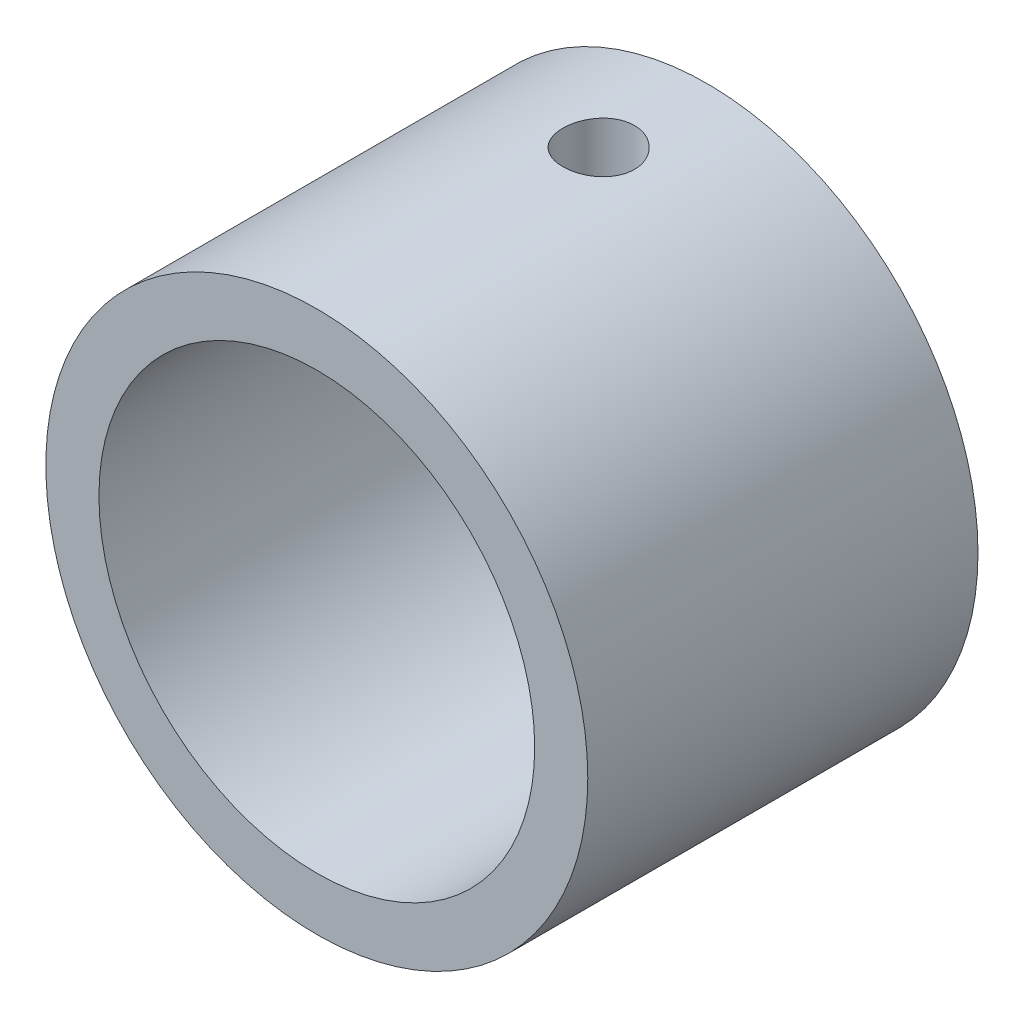
ISO-10303-21;
HEADER;
FILE_DESCRIPTION(('STEP AP214'),'2;1');
FILE_NAME('part.step','',(''),(''),'','','');
FILE_SCHEMA(('AUTOMOTIVE_DESIGN { 1 0 10303 214 1 1 1 1 }'));
ENDSEC;
DATA;
#1=APPLICATION_CONTEXT('core data for automotive mechanical design processes');
#2=APPLICATION_PROTOCOL_DEFINITION('international standard','automotive_design',2000,#1);
#3=PRODUCT_CONTEXT('',#1,'mechanical');
#4=PRODUCT('Part','Part','',(#3));
#5=PRODUCT_RELATED_PRODUCT_CATEGORY('part','',(#4));
#6=PRODUCT_DEFINITION_FORMATION('','',#4);
#7=PRODUCT_DEFINITION_CONTEXT('part definition',#1,'design');
#8=PRODUCT_DEFINITION('design','',#6,#7);
#9=PRODUCT_DEFINITION_SHAPE('','',#8);
#10=(LENGTH_UNIT() NAMED_UNIT(*) SI_UNIT(.MILLI.,.METRE.));
#11=(NAMED_UNIT(*) PLANE_ANGLE_UNIT() SI_UNIT($,.RADIAN.));
#12=(NAMED_UNIT(*) SI_UNIT($,.STERADIAN.) SOLID_ANGLE_UNIT());
#13=UNCERTAINTY_MEASURE_WITH_UNIT(LENGTH_MEASURE(1.E-05),#10,'distance_accuracy_value','');
#14=(GEOMETRIC_REPRESENTATION_CONTEXT(3) GLOBAL_UNCERTAINTY_ASSIGNED_CONTEXT((#13)) GLOBAL_UNIT_ASSIGNED_CONTEXT((#10,
#11,#12)) REPRESENTATION_CONTEXT('',''));
#15=CARTESIAN_POINT('',(0.,0.,0.));
#16=DIRECTION('',(0.,0.,1.));
#17=DIRECTION('',(1.,0.,0.));
#18=AXIS2_PLACEMENT_3D('',#15,#16,#17);
#19=CARTESIAN_POINT('',(0.,0.,18.));
#20=DIRECTION('',(0.,0.,-1.));
#21=DIRECTION('',(-1.,0.,0.));
#22=AXIS2_PLACEMENT_3D('',#19,#20,#21);
#23=CYLINDRICAL_SURFACE('',#22,12.5);
#24=CARTESIAN_POINT('',(0.,12.5,3.35));
#25=CARTESIAN_POINT('',(0.0922509659142324,12.4999986553884,3.35000389150703));
#26=CARTESIAN_POINT('',(0.184558502715377,12.498968007311,3.35776267709436));
#27=CARTESIAN_POINT('',(0.366601950920958,12.4949556982822,3.38858980345606));
#28=CARTESIAN_POINT('',(0.4563351259759,12.4919720361882,3.41167384749907));
#29=CARTESIAN_POINT('',(0.630568283941343,12.4843896079466,3.47245693419571));
#30=CARTESIAN_POINT('',(0.71507185631948,12.4797919643879,3.51014582048222));
#31=CARTESIAN_POINT('',(0.876539590939074,12.4694920533569,3.59904581496625));
#32=CARTESIAN_POINT('',(0.953504978702877,12.4637899658902,3.65025472012364));
#33=CARTESIAN_POINT('',(1.09819718658205,12.4518781663594,3.7650753837501));
#34=CARTESIAN_POINT('',(1.1658712816474,12.4456658531834,3.82875332108865));
#35=CARTESIAN_POINT('',(1.28960557413889,12.4334545778039,3.9665622546111));
#36=CARTESIAN_POINT('',(1.34566516063208,12.4274556268374,4.04069380031909));
#37=CARTESIAN_POINT('',(1.44477796066646,12.4163248280925,4.19765149365061));
#38=CARTESIAN_POINT('',(1.48778133107337,12.4111963353939,4.28050937377425));
#39=CARTESIAN_POINT('',(1.55924262980494,12.4024218004722,4.45235015180618));
#40=CARTESIAN_POINT('',(1.58770117215908,12.3987756956693,4.54133279096954));
#41=CARTESIAN_POINT('',(1.62910377910463,12.3934038347284,4.72234784890981));
#42=CARTESIAN_POINT('',(1.64213723047393,12.3916670186782,4.81435948871567));
#43=CARTESIAN_POINT('',(1.6525963615546,12.3902766213381,4.99927914827236));
#44=CARTESIAN_POINT('',(1.65002273886784,12.3906229469364,5.09218712777345));
#45=CARTESIAN_POINT('',(1.6294140660036,12.3933495814873,5.27563699086018));
#46=CARTESIAN_POINT('',(1.61147776254764,12.395716899785,5.36619018822611));
#47=CARTESIAN_POINT('',(1.56080707632498,12.4021985149079,5.54299015751685));
#48=CARTESIAN_POINT('',(1.52807236230629,12.4063128508388,5.6292368329952));
#49=CARTESIAN_POINT('',(1.44862884068035,12.4158395520745,5.79528063970321));
#50=CARTESIAN_POINT('',(1.40187740731702,12.4212558666767,5.87505714083283));
#51=CARTESIAN_POINT('',(1.29575800474392,12.4327732471151,6.02566987367712));
#52=CARTESIAN_POINT('',(1.23638939245273,12.4388743478466,6.09650564940105));
#53=CARTESIAN_POINT('',(1.10617499798151,12.4511315214541,6.22779910123927));
#54=CARTESIAN_POINT('',(1.03524415653744,12.4572876551224,6.288172443475));
#55=CARTESIAN_POINT('',(0.884210857811213,12.4689172796715,6.3961696449878));
#56=CARTESIAN_POINT('',(0.804108375018418,12.4743907686536,6.44379346880128));
#57=CARTESIAN_POINT('',(0.636938460986385,12.484042355461,6.5249409446003));
#58=CARTESIAN_POINT('',(0.549868279152675,12.4882199385046,6.55845899513268));
#59=CARTESIAN_POINT('',(0.371267976474138,12.4948044580827,6.61037485956513));
#60=CARTESIAN_POINT('',(0.279738088894881,12.4972114871206,6.6287734633927));
#61=CARTESIAN_POINT('',(0.0955454110605672,12.4999716099048,6.64981811969115));
#62=CARTESIAN_POINT('',(0.00289610511857279,12.5003398427993,6.65258028450897));
#63=CARTESIAN_POINT('',(-0.181544148381852,12.4990218465851,6.64258054262136));
#64=CARTESIAN_POINT('',(-0.273335116324652,12.4973356663916,6.62981900553124));
#65=CARTESIAN_POINT('',(-0.453108088985705,12.4921077115532,6.5892306026245));
#66=CARTESIAN_POINT('',(-0.54110288153432,12.4885727966281,6.56145941737239));
#67=CARTESIAN_POINT('',(-0.711186579168435,12.4800429260914,6.49169814598314));
#68=CARTESIAN_POINT('',(-0.793275262802482,12.4750479157687,6.44970752702029));
#69=CARTESIAN_POINT('',(-0.949733027407939,12.4641165128389,6.35242066007777));
#70=CARTESIAN_POINT('',(-1.02405527014396,12.4581748993319,6.29704968324978));
#71=CARTESIAN_POINT('',(-1.16239311646149,12.4460304374708,6.17467915559439));
#72=CARTESIAN_POINT('',(-1.22640826160188,12.4398275775125,6.10767908780128));
#73=CARTESIAN_POINT('',(-1.34272949930146,12.427812668937,5.96343933060332));
#74=CARTESIAN_POINT('',(-1.39495839046207,12.422003362126,5.88613712057612));
#75=CARTESIAN_POINT('',(-1.48569034045958,12.4114793355964,5.72378924080387));
#76=CARTESIAN_POINT('',(-1.52419370073337,12.40676459184,5.63874374116663));
#77=CARTESIAN_POINT('',(-1.58625802021031,12.3989825257156,5.46356754240219));
#78=CARTESIAN_POINT('',(-1.60986174308102,12.395910492496,5.37345221257723));
#79=CARTESIAN_POINT('',(-1.64159408961649,12.3917484325846,5.19049367855156));
#80=CARTESIAN_POINT('',(-1.64972352322195,12.390658302158,5.09765061738152));
#81=CARTESIAN_POINT('',(-1.65026050729394,12.3905867313463,4.91264048140781));
#82=CARTESIAN_POINT('',(-1.6427893634322,12.3915890208826,4.82047374161902));
#83=CARTESIAN_POINT('',(-1.61259495475241,12.3955542787341,4.63871858376871));
#84=CARTESIAN_POINT('',(-1.58987169439037,12.3985172464765,4.54913016495395));
#85=CARTESIAN_POINT('',(-1.52985734760344,12.4060648042427,4.37509536720208));
#86=CARTESIAN_POINT('',(-1.49257280459361,12.4106486657967,4.2906466982857));
#87=CARTESIAN_POINT('',(-1.40450618423476,12.4209226365687,4.12918453461483));
#88=CARTESIAN_POINT('',(-1.35372386121888,12.4266127659209,4.05217117522175));
#89=CARTESIAN_POINT('',(-1.23965546715595,12.4385110765891,3.90714655415514));
#90=CARTESIAN_POINT('',(-1.17627910409951,12.4447228000133,3.8392065959392));
#91=CARTESIAN_POINT('',(-1.03901112502639,12.4569335544568,3.71488064994685));
#92=CARTESIAN_POINT('',(-0.965117043774381,12.4629325351987,3.65849737850979));
#93=CARTESIAN_POINT('',(-0.808549280168614,12.4740702486112,3.55867888501618));
#94=CARTESIAN_POINT('',(-0.725839748433107,12.4792052313115,3.51529949779812));
#95=CARTESIAN_POINT('',(-0.554286102127641,12.4879988146703,3.44310916931126));
#96=CARTESIAN_POINT('',(-0.465448689177245,12.4916589991428,3.41428259103999));
#97=CARTESIAN_POINT('',(-0.313472456145789,12.4962204250721,3.37882265613531));
#98=CARTESIAN_POINT('',(-0.251287086879961,12.4976307637456,3.36802994756124));
#99=CARTESIAN_POINT('',(-0.126076615825899,12.4995210067266,3.3536173203671));
#100=CARTESIAN_POINT('',(-0.0630515212430907,12.5000009190127,3.3499973402399));
#101=CARTESIAN_POINT('',(0.,12.5,3.35));
#102=B_SPLINE_CURVE_WITH_KNOTS('',3,(#24,#25,#26,#27,#28,#29,#30,#31,#32,#33,#34,#35,#36,#37,
#38,#39,#40,#41,#42,#43,#44,#45,#46,#47,#48,#49,#50,#51,#52,#53,#54,#55,#56,#57,#58,#59,#60,#61,
#62,#63,#64,#65,#66,#67,#68,#69,#70,#71,#72,#73,#74,#75,#76,#77,#78,#79,#80,#81,#82,#83,#84,#85,
#86,#87,#88,#89,#90,#91,#92,#93,#94,#95,#96,#97,#98,#99,#100,#101),.UNSPECIFIED.,.T.,.F.,(4,2,2,
2,2,2,2,2,2,2,2,2,2,2,2,2,2,2,2,2,2,2,2,2,2,2,2,2,2,2,2,2,2,2,2,2,2,2,4),(0.,0.27652256759341,
0.553328916636196,0.829943115961213,1.106512269752,1.38459116209452,1.66268467791007,
1.94182686179847,2.22095726035026,2.49846208170459,2.77595449929574,3.05167655007196,
3.32740477299745,3.60398015842833,3.88056964393413,4.159294237539,4.43801960642627,
4.71685555395558,4.99567693255305,5.27242510869489,5.5491666956633,5.82488864439133,
6.10062092602062,6.37793027840446,6.65525196160273,6.93434056471004,7.21342303816142,
7.49170082672567,7.76996404953484,8.04607163604137,8.3221791418815,8.59816271557356,
8.87415131265901,9.15219502941573,9.43030402415318,9.70959057439001,9.98857638890452,
10.1775751477029,10.3665722858035),.UNSPECIFIED.);
#103=CARTESIAN_POINT('',(0.,12.5,3.35));
#104=VERTEX_POINT('',#103);
#105=EDGE_CURVE('E76',#104,#104,#102,.T.);
#106=ORIENTED_EDGE('',*,*,#105,.T.);
#107=EDGE_LOOP('',(#106));
#108=FACE_BOUND('',#107,.T.);
#109=CARTESIAN_POINT('',(0.,-12.5,3.35));
#110=CARTESIAN_POINT('',(-0.0922509659142324,-12.4999986553884,3.35000389150703));
#111=CARTESIAN_POINT('',(-0.184558502715377,-12.498968007311,3.35776267709436));
#112=CARTESIAN_POINT('',(-0.366601950920958,-12.4949556982822,3.38858980345606));
#113=CARTESIAN_POINT('',(-0.4563351259759,-12.4919720361882,3.41167384749907));
#114=CARTESIAN_POINT('',(-0.630568283941343,-12.4843896079466,3.47245693419571));
#115=CARTESIAN_POINT('',(-0.71507185631948,-12.4797919643879,3.51014582048222));
#116=CARTESIAN_POINT('',(-0.876539590939074,-12.4694920533569,3.59904581496625));
#117=CARTESIAN_POINT('',(-0.953504978702877,-12.4637899658902,3.65025472012364));
#118=CARTESIAN_POINT('',(-1.09819718658205,-12.4518781663594,3.7650753837501));
#119=CARTESIAN_POINT('',(-1.1658712816474,-12.4456658531834,3.82875332108865));
#120=CARTESIAN_POINT('',(-1.28960557413889,-12.4334545778039,3.9665622546111));
#121=CARTESIAN_POINT('',(-1.34566516063208,-12.4274556268374,4.04069380031909));
#122=CARTESIAN_POINT('',(-1.44477796066646,-12.4163248280925,4.19765149365061));
#123=CARTESIAN_POINT('',(-1.48778133107337,-12.4111963353939,4.28050937377425));
#124=CARTESIAN_POINT('',(-1.55924262980494,-12.4024218004722,4.45235015180618));
#125=CARTESIAN_POINT('',(-1.58770117215908,-12.3987756956693,4.54133279096954));
#126=CARTESIAN_POINT('',(-1.62910377910463,-12.3934038347284,4.72234784890981));
#127=CARTESIAN_POINT('',(-1.64213723047393,-12.3916670186782,4.81435948871567));
#128=CARTESIAN_POINT('',(-1.6525963615546,-12.3902766213381,4.99927914827236));
#129=CARTESIAN_POINT('',(-1.65002273886784,-12.3906229469364,5.09218712777345));
#130=CARTESIAN_POINT('',(-1.6294140660036,-12.3933495814873,5.27563699086018));
#131=CARTESIAN_POINT('',(-1.61147776254764,-12.395716899785,5.36619018822611));
#132=CARTESIAN_POINT('',(-1.56080707632498,-12.4021985149079,5.54299015751685));
#133=CARTESIAN_POINT('',(-1.52807236230629,-12.4063128508388,5.6292368329952));
#134=CARTESIAN_POINT('',(-1.44862884068035,-12.4158395520745,5.79528063970321));
#135=CARTESIAN_POINT('',(-1.40187740731702,-12.4212558666767,5.87505714083283));
#136=CARTESIAN_POINT('',(-1.29575800474392,-12.4327732471151,6.02566987367712));
#137=CARTESIAN_POINT('',(-1.23638939245273,-12.4388743478466,6.09650564940105));
#138=CARTESIAN_POINT('',(-1.10617499798151,-12.4511315214541,6.22779910123927));
#139=CARTESIAN_POINT('',(-1.03524415653744,-12.4572876551224,6.288172443475));
#140=CARTESIAN_POINT('',(-0.884210857811213,-12.4689172796715,6.3961696449878));
#141=CARTESIAN_POINT('',(-0.804108375018418,-12.4743907686536,6.44379346880128));
#142=CARTESIAN_POINT('',(-0.636938460986385,-12.484042355461,6.5249409446003));
#143=CARTESIAN_POINT('',(-0.549868279152675,-12.4882199385046,6.55845899513268));
#144=CARTESIAN_POINT('',(-0.371267976474138,-12.4948044580827,6.61037485956513));
#145=CARTESIAN_POINT('',(-0.279738088894881,-12.4972114871206,6.6287734633927));
#146=CARTESIAN_POINT('',(-0.0955454110605672,-12.4999716099048,6.64981811969115));
#147=CARTESIAN_POINT('',(-0.00289610511857279,-12.5003398427993,6.65258028450897));
#148=CARTESIAN_POINT('',(0.181544148381852,-12.4990218465851,6.64258054262136));
#149=CARTESIAN_POINT('',(0.273335116324652,-12.4973356663916,6.62981900553124));
#150=CARTESIAN_POINT('',(0.453108088985705,-12.4921077115532,6.5892306026245));
#151=CARTESIAN_POINT('',(0.54110288153432,-12.4885727966281,6.56145941737239));
#152=CARTESIAN_POINT('',(0.711186579168435,-12.4800429260914,6.49169814598314));
#153=CARTESIAN_POINT('',(0.793275262802482,-12.4750479157687,6.44970752702029));
#154=CARTESIAN_POINT('',(0.949733027407939,-12.4641165128389,6.35242066007777));
#155=CARTESIAN_POINT('',(1.02405527014396,-12.4581748993319,6.29704968324978));
#156=CARTESIAN_POINT('',(1.16239311646149,-12.4460304374708,6.17467915559439));
#157=CARTESIAN_POINT('',(1.22640826160188,-12.4398275775125,6.10767908780128));
#158=CARTESIAN_POINT('',(1.34272949930146,-12.427812668937,5.96343933060332));
#159=CARTESIAN_POINT('',(1.39495839046207,-12.422003362126,5.88613712057612));
#160=CARTESIAN_POINT('',(1.48569034045958,-12.4114793355964,5.72378924080387));
#161=CARTESIAN_POINT('',(1.52419370073337,-12.40676459184,5.63874374116663));
#162=CARTESIAN_POINT('',(1.58625802021031,-12.3989825257156,5.46356754240219));
#163=CARTESIAN_POINT('',(1.60986174308102,-12.395910492496,5.37345221257723));
#164=CARTESIAN_POINT('',(1.64159408961649,-12.3917484325846,5.19049367855156));
#165=CARTESIAN_POINT('',(1.64972352322195,-12.390658302158,5.09765061738152));
#166=CARTESIAN_POINT('',(1.65026050729394,-12.3905867313463,4.91264048140781));
#167=CARTESIAN_POINT('',(1.6427893634322,-12.3915890208826,4.82047374161902));
#168=CARTESIAN_POINT('',(1.61259495475241,-12.3955542787341,4.63871858376871));
#169=CARTESIAN_POINT('',(1.58987169439037,-12.3985172464765,4.54913016495395));
#170=CARTESIAN_POINT('',(1.52985734760344,-12.4060648042427,4.37509536720208));
#171=CARTESIAN_POINT('',(1.49257280459361,-12.4106486657967,4.2906466982857));
#172=CARTESIAN_POINT('',(1.40450618423476,-12.4209226365687,4.12918453461483));
#173=CARTESIAN_POINT('',(1.35372386121888,-12.4266127659209,4.05217117522175));
#174=CARTESIAN_POINT('',(1.23965546715595,-12.4385110765891,3.90714655415514));
#175=CARTESIAN_POINT('',(1.17627910409951,-12.4447228000133,3.8392065959392));
#176=CARTESIAN_POINT('',(1.03901112502639,-12.4569335544568,3.71488064994685));
#177=CARTESIAN_POINT('',(0.965117043774381,-12.4629325351987,3.65849737850979));
#178=CARTESIAN_POINT('',(0.808549280168614,-12.4740702486112,3.55867888501618));
#179=CARTESIAN_POINT('',(0.725839748433107,-12.4792052313115,3.51529949779812));
#180=CARTESIAN_POINT('',(0.554286102127641,-12.4879988146703,3.44310916931126));
#181=CARTESIAN_POINT('',(0.465448689177245,-12.4916589991428,3.41428259103999));
#182=CARTESIAN_POINT('',(0.313472456145789,-12.4962204250721,3.37882265613531));
#183=CARTESIAN_POINT('',(0.251287086879961,-12.4976307637456,3.36802994756124));
#184=CARTESIAN_POINT('',(0.126076615825899,-12.4995210067266,3.3536173203671));
#185=CARTESIAN_POINT('',(0.0630515212430907,-12.5000009190127,3.3499973402399));
#186=CARTESIAN_POINT('',(0.,-12.5,3.35));
#187=B_SPLINE_CURVE_WITH_KNOTS('',3,(#109,#110,#111,#112,#113,#114,#115,#116,#117,#118,#119,
#120,#121,#122,#123,#124,#125,#126,#127,#128,#129,#130,#131,#132,#133,#134,#135,#136,#137,#138,
#139,#140,#141,#142,#143,#144,#145,#146,#147,#148,#149,#150,#151,#152,#153,#154,#155,#156,#157,
#158,#159,#160,#161,#162,#163,#164,#165,#166,#167,#168,#169,#170,#171,#172,#173,#174,#175,#176,
#177,#178,#179,#180,#181,#182,#183,#184,#185,#186),.UNSPECIFIED.,.T.,.F.,(4,2,2,2,2,2,2,2,2,2,2,
2,2,2,2,2,2,2,2,2,2,2,2,2,2,2,2,2,2,2,2,2,2,2,2,2,2,2,4),(0.,0.27652256759341,0.553328916636196,
0.829943115961213,1.106512269752,1.38459116209452,1.66268467791007,1.94182686179847,
2.22095726035026,2.49846208170459,2.77595449929574,3.05167655007196,3.32740477299745,
3.60398015842833,3.88056964393413,4.159294237539,4.43801960642627,4.71685555395558,
4.99567693255305,5.27242510869489,5.5491666956633,5.82488864439133,6.10062092602062,
6.37793027840446,6.65525196160273,6.93434056471004,7.21342303816142,7.49170082672567,
7.76996404953484,8.04607163604137,8.3221791418815,8.59816271557356,8.87415131265901,
9.15219502941573,9.43030402415318,9.70959057439001,9.98857638890452,10.1775751477029,
10.3665722858035),.UNSPECIFIED.);
#188=CARTESIAN_POINT('',(0.,-12.5,3.35));
#189=VERTEX_POINT('',#188);
#190=EDGE_CURVE('E71',#189,#189,#187,.T.);
#191=ORIENTED_EDGE('',*,*,#190,.T.);
#192=EDGE_LOOP('',(#191));
#193=FACE_BOUND('',#192,.T.);
#194=CARTESIAN_POINT('',(0.,0.,18.));
#195=DIRECTION('',(0.,0.,1.));
#196=DIRECTION('',(1.,0.,0.));
#197=AXIS2_PLACEMENT_3D('',#194,#195,#196);
#198=CIRCLE('',#197,12.5);
#199=CARTESIAN_POINT('',(12.5,0.,18.));
#200=VERTEX_POINT('',#199);
#201=EDGE_CURVE('E10',#200,#200,#198,.T.);
#202=ORIENTED_EDGE('',*,*,#201,.F.);
#203=EDGE_LOOP('',(#202));
#204=FACE_BOUND('',#203,.T.);
#205=CARTESIAN_POINT('',(0.,0.,0.));
#206=DIRECTION('',(0.,0.,1.));
#207=DIRECTION('',(1.,0.,0.));
#208=AXIS2_PLACEMENT_3D('',#205,#206,#207);
#209=CIRCLE('',#208,12.5);
#210=CARTESIAN_POINT('',(12.5,0.,0.));
#211=VERTEX_POINT('',#210);
#212=EDGE_CURVE('E44',#211,#211,#209,.T.);
#213=ORIENTED_EDGE('',*,*,#212,.T.);
#214=EDGE_LOOP('',(#213));
#215=FACE_BOUND('',#214,.T.);
#216=ADVANCED_FACE('F31',(#108,#193,#204,#215),#23,.T.);
#217=CARTESIAN_POINT('',(0.,0.,18.));
#218=DIRECTION('',(0.,0.,1.));
#219=DIRECTION('',(1.,0.,0.));
#220=AXIS2_PLACEMENT_3D('',#217,#218,#219);
#221=PLANE('',#220);
#222=CARTESIAN_POINT('',(0.,0.,18.));
#223=DIRECTION('',(0.,0.,1.));
#224=DIRECTION('',(1.,0.,0.));
#225=AXIS2_PLACEMENT_3D('',#222,#223,#224);
#226=CIRCLE('',#225,10.05);
#227=CARTESIAN_POINT('',(10.05,0.,18.));
#228=VERTEX_POINT('',#227);
#229=EDGE_CURVE('E49',#228,#228,#226,.T.);
#230=ORIENTED_EDGE('',*,*,#229,.F.);
#231=EDGE_LOOP('',(#230));
#232=FACE_BOUND('',#231,.T.);
#233=ORIENTED_EDGE('',*,*,#201,.T.);
#234=EDGE_LOOP('',(#233));
#235=FACE_BOUND('',#234,.T.);
#236=ADVANCED_FACE('F90',(#232,#235),#221,.T.);
#237=CARTESIAN_POINT('',(0.,0.,0.));
#238=DIRECTION('',(0.,0.,1.));
#239=DIRECTION('',(1.,0.,0.));
#240=AXIS2_PLACEMENT_3D('',#237,#238,#239);
#241=PLANE('',#240);
#242=CARTESIAN_POINT('',(0.,0.,0.));
#243=DIRECTION('',(0.,0.,1.));
#244=DIRECTION('',(1.,0.,0.));
#245=AXIS2_PLACEMENT_3D('',#242,#243,#244);
#246=CIRCLE('',#245,10.05);
#247=CARTESIAN_POINT('',(10.05,0.,0.));
#248=VERTEX_POINT('',#247);
#249=EDGE_CURVE('E81',#248,#248,#246,.T.);
#250=ORIENTED_EDGE('',*,*,#249,.T.);
#251=EDGE_LOOP('',(#250));
#252=FACE_BOUND('',#251,.T.);
#253=ORIENTED_EDGE('',*,*,#212,.F.);
#254=EDGE_LOOP('',(#253));
#255=FACE_BOUND('',#254,.T.);
#256=ADVANCED_FACE('F92',(#252,#255),#241,.F.);
#257=CARTESIAN_POINT('',(0.,0.,0.));
#258=DIRECTION('',(0.,0.,1.));
#259=DIRECTION('',(1.,0.,0.));
#260=AXIS2_PLACEMENT_3D('',#257,#258,#259);
#261=CYLINDRICAL_SURFACE('',#260,10.05);
#262=CARTESIAN_POINT('',(0.,10.05,3.35));
#263=CARTESIAN_POINT('',(-0.0920180329327724,10.0499984370443,3.35000370692742));
#264=CARTESIAN_POINT('',(-0.184086780494825,10.0487230447276,3.35772356253367));
#265=CARTESIAN_POINT('',(-0.365643401070694,10.043758055606,3.3883869572058));
#266=CARTESIAN_POINT('',(-0.455128798557863,10.0400662184774,3.41134462376199));
#267=CARTESIAN_POINT('',(-0.628865582833329,10.0306825513681,3.47177292893355));
#268=CARTESIAN_POINT('',(-0.713121136953697,10.0249923384807,3.50923183559006));
#269=CARTESIAN_POINT('',(-0.874140021172378,10.0122380593047,3.597568894481));
#270=CARTESIAN_POINT('',(-0.950904235109421,10.0051741553811,3.64844546105259));
#271=CARTESIAN_POINT('',(-1.09548549310904,9.99038259054436,3.76267647057008));
#272=CARTESIAN_POINT('',(-1.16322285823918,9.98264990017795,3.82613112195422));
#273=CARTESIAN_POINT('',(-1.28713945807741,9.96743091485469,3.96350137039993));
#274=CARTESIAN_POINT('',(-1.34331797358523,9.95994463525404,4.03741761790716));
#275=CARTESIAN_POINT('',(-1.44284008040123,9.94601737362578,4.19415834085049));
#276=CARTESIAN_POINT('',(-1.48610514301644,9.93958289060425,4.27703330569017));
#277=CARTESIAN_POINT('',(-1.55807008090098,9.92855736502088,4.44899761843703));
#278=CARTESIAN_POINT('',(-1.58677091013214,9.92396620172512,4.53808655889197));
#279=CARTESIAN_POINT('',(-1.62854217790329,9.91719711345879,4.71910630428544));
#280=CARTESIAN_POINT('',(-1.64175000182619,9.91499798978263,4.81100459920139));
#281=CARTESIAN_POINT('',(-1.65258624588289,9.91319781090221,4.99573731639622));
#282=CARTESIAN_POINT('',(-1.65021573599762,9.91359657726467,5.08857167394535));
#283=CARTESIAN_POINT('',(-1.63007456453797,9.91692776354158,5.27156215550139));
#284=CARTESIAN_POINT('',(-1.61245802990308,9.9198348254104,5.36173577246638));
#285=CARTESIAN_POINT('',(-1.5625666612546,9.92781536861481,5.53782979523721));
#286=CARTESIAN_POINT('',(-1.53029133811106,9.93288892224089,5.62375005901237));
#287=CARTESIAN_POINT('',(-1.4518416805706,9.94465827599469,5.78936099332723));
#288=CARTESIAN_POINT('',(-1.40560314536227,9.9513615409385,5.86902069974417));
#289=CARTESIAN_POINT('',(-1.30058520962102,9.96562981296695,6.01950904256078));
#290=CARTESIAN_POINT('',(-1.24180482624939,9.97319488756541,6.09033698617203));
#291=CARTESIAN_POINT('',(-1.11253101844653,9.98844590415614,6.22204358941843));
#292=CARTESIAN_POINT('',(-1.04190531219169,9.9961322060661,6.28279244386867));
#293=CARTESIAN_POINT('',(-0.891393586399611,10.0106755195969,6.3915963402664));
#294=CARTESIAN_POINT('',(-0.811507510433438,10.0175325261638,6.43965130485664));
#295=CARTESIAN_POINT('',(-0.644622153004777,10.0296539695544,6.52171432728708));
#296=CARTESIAN_POINT('',(-0.557617245689085,10.034917131052,6.55571114431169));
#297=CARTESIAN_POINT('',(-0.37902696025481,10.043247566799,6.60857355080302));
#298=CARTESIAN_POINT('',(-0.28744195446806,10.0463150192357,6.62744036812168));
#299=CARTESIAN_POINT('',(-0.103410268552478,10.0498845138255,6.64933177207762));
#300=CARTESIAN_POINT('',(-0.010985330485597,10.0504154170395,6.65253459486102));
#301=CARTESIAN_POINT('',(0.173080735114018,10.0489309673542,6.64348195240312));
#302=CARTESIAN_POINT('',(0.264721891753469,10.0469157094267,6.63122706373508));
#303=CARTESIAN_POINT('',(0.444070159748101,10.0405832398353,6.59175511202367));
#304=CARTESIAN_POINT('',(0.531797163208801,10.0362795750517,6.56462607168771));
#305=CARTESIAN_POINT('',(0.701457781611595,10.0258509758994,6.49626958828008));
#306=CARTESIAN_POINT('',(0.783391078972734,10.0197259417883,6.45504137308651));
#307=CARTESIAN_POINT('',(0.939914183530767,10.0062626620491,6.35924709668296));
#308=CARTESIAN_POINT('',(1.01443481237377,9.99891444029673,6.30456943038438));
#309=CARTESIAN_POINT('',(1.1533063276579,9.98385059246088,6.1835821626607));
#310=CARTESIAN_POINT('',(1.21765649802128,9.97613494055729,6.11727174289406));
#311=CARTESIAN_POINT('',(1.33501923010389,9.96111279236415,5.97410279586138));
#312=CARTESIAN_POINT('',(1.38791151159428,9.95381118014088,5.89714507603676));
#313=CARTESIAN_POINT('',(1.48001763416633,9.94053430854275,5.7353323097033));
#314=CARTESIAN_POINT('',(1.51923189941182,9.93455900804024,5.65047750819129));
#315=CARTESIAN_POINT('',(1.58268792942257,9.92464775693468,5.47561907962732));
#316=CARTESIAN_POINT('',(1.60699009562649,9.92070358981418,5.38563785892158));
#317=CARTESIAN_POINT('',(1.64012250401262,9.91528037333729,5.20280055377115));
#318=CARTESIAN_POINT('',(1.64895404762513,9.91380111662654,5.10994471181616));
#319=CARTESIAN_POINT('',(1.6508590472903,9.91348396139325,4.92519472572506));
#320=CARTESIAN_POINT('',(1.64412179582373,9.9146143336567,4.83330253284866));
#321=CARTESIAN_POINT('',(1.61548919275561,9.91931962358776,4.65197792882349));
#322=CARTESIAN_POINT('',(1.59359388614146,9.92289453400027,4.56254551037521));
#323=CARTESIAN_POINT('',(1.53533836087802,9.93207418946562,4.38874909657881));
#324=CARTESIAN_POINT('',(1.49899396503279,9.93767671353418,4.30437967281821));
#325=CARTESIAN_POINT('',(1.41289128654582,9.95028256568846,4.14290519498403));
#326=CARTESIAN_POINT('',(1.36313237102204,9.95728595986164,4.06580048388315));
#327=CARTESIAN_POINT('',(1.25093565373741,9.9720052612655,3.92008693969188));
#328=CARTESIAN_POINT('',(1.18835844035492,9.97972844504294,3.85158617107772));
#329=CARTESIAN_POINT('',(1.05259559530017,9.99495866153383,3.72599251746745));
#330=CARTESIAN_POINT('',(0.979407516542728,10.0024656439068,3.66890227121769));
#331=CARTESIAN_POINT('',(0.823920038598434,10.016475634968,3.56740271325115));
#332=CARTESIAN_POINT('',(0.741563026084989,10.0229716000235,3.52308068335694));
#333=CARTESIAN_POINT('',(0.570500491818132,10.0341590369023,3.44896797098688));
#334=CARTESIAN_POINT('',(0.481801435082907,10.0388523161158,3.41916272576191));
#335=CARTESIAN_POINT('',(0.327290986401002,10.044874026994,3.38144461107589));
#336=CARTESIAN_POINT('',(0.262417400044853,10.0467860552947,3.36967163120094));
#337=CARTESIAN_POINT('',(0.131704526429437,10.0493495908241,3.35394806317547));
#338=CARTESIAN_POINT('',(0.0658652550386082,10.0500011187424,3.34999734663182));
#339=CARTESIAN_POINT('',(0.,10.05,3.35));
#340=B_SPLINE_CURVE_WITH_KNOTS('',3,(#262,#263,#264,#265,#266,#267,#268,#269,#270,#271,#272,
#273,#274,#275,#276,#277,#278,#279,#280,#281,#282,#283,#284,#285,#286,#287,#288,#289,#290,#291,
#292,#293,#294,#295,#296,#297,#298,#299,#300,#301,#302,#303,#304,#305,#306,#307,#308,#309,#310,
#311,#312,#313,#314,#315,#316,#317,#318,#319,#320,#321,#322,#323,#324,#325,#326,#327,#328,#329,
#330,#331,#332,#333,#334,#335,#336,#337,#338,#339),.UNSPECIFIED.,.T.,.F.,(4,2,2,2,2,2,2,2,2,2,2,
2,2,2,2,2,2,2,2,2,2,2,2,2,2,2,2,2,2,2,2,2,2,2,2,2,2,2,4),(0.,0.27581335440413,0.551882782568048,
0.827729327089602,1.10354328740684,1.3816499878411,1.65977398705272,1.93955636717505,
2.21932041909816,2.4965844248172,2.77382938715837,3.04830390332794,3.32278757875189,
3.59855301861754,3.87434007671316,4.15344165836414,4.43254494083597,4.71187096318889,
4.99117431497212,5.26729203826757,5.54339946266538,5.81789029516,6.09239616217537,
6.36926166786903,6.64614665832758,6.92581078567467,7.20546623969097,7.48398134048589,
7.76247301071765,8.03759649673392,8.31271916621803,8.58754138258575,8.86237656702803,
9.14037676556821,9.41844117899431,9.69836359377361,9.97800461846878,10.1754313025758,
10.3728547461323),.UNSPECIFIED.);
#341=CARTESIAN_POINT('',(0.,10.05,3.35));
#342=VERTEX_POINT('',#341);
#343=EDGE_CURVE('E35',#342,#342,#340,.T.);
#344=ORIENTED_EDGE('',*,*,#343,.T.);
#345=EDGE_LOOP('',(#344));
#346=FACE_BOUND('',#345,.T.);
#347=CARTESIAN_POINT('',(0.,-10.05,3.35));
#348=CARTESIAN_POINT('',(0.0920180329327724,-10.0499984370443,3.35000370692742));
#349=CARTESIAN_POINT('',(0.184086780494825,-10.0487230447276,3.35772356253367));
#350=CARTESIAN_POINT('',(0.365643401070694,-10.043758055606,3.3883869572058));
#351=CARTESIAN_POINT('',(0.455128798557863,-10.0400662184774,3.41134462376199));
#352=CARTESIAN_POINT('',(0.628865582833329,-10.0306825513681,3.47177292893355));
#353=CARTESIAN_POINT('',(0.713121136953697,-10.0249923384807,3.50923183559006));
#354=CARTESIAN_POINT('',(0.874140021172378,-10.0122380593047,3.597568894481));
#355=CARTESIAN_POINT('',(0.950904235109421,-10.0051741553811,3.64844546105259));
#356=CARTESIAN_POINT('',(1.09548549310904,-9.99038259054436,3.76267647057008));
#357=CARTESIAN_POINT('',(1.16322285823918,-9.98264990017795,3.82613112195422));
#358=CARTESIAN_POINT('',(1.28713945807741,-9.96743091485469,3.96350137039993));
#359=CARTESIAN_POINT('',(1.34331797358523,-9.95994463525404,4.03741761790716));
#360=CARTESIAN_POINT('',(1.44284008040123,-9.94601737362578,4.19415834085049));
#361=CARTESIAN_POINT('',(1.48610514301644,-9.93958289060425,4.27703330569017));
#362=CARTESIAN_POINT('',(1.55807008090098,-9.92855736502088,4.44899761843703));
#363=CARTESIAN_POINT('',(1.58677091013214,-9.92396620172512,4.53808655889197));
#364=CARTESIAN_POINT('',(1.62854217790329,-9.91719711345879,4.71910630428544));
#365=CARTESIAN_POINT('',(1.64175000182619,-9.91499798978263,4.81100459920139));
#366=CARTESIAN_POINT('',(1.65258624588289,-9.91319781090221,4.99573731639622));
#367=CARTESIAN_POINT('',(1.65021573599762,-9.91359657726467,5.08857167394535));
#368=CARTESIAN_POINT('',(1.63007456453797,-9.91692776354158,5.27156215550139));
#369=CARTESIAN_POINT('',(1.61245802990308,-9.9198348254104,5.36173577246638));
#370=CARTESIAN_POINT('',(1.5625666612546,-9.92781536861481,5.53782979523721));
#371=CARTESIAN_POINT('',(1.53029133811106,-9.93288892224089,5.62375005901237));
#372=CARTESIAN_POINT('',(1.4518416805706,-9.94465827599469,5.78936099332723));
#373=CARTESIAN_POINT('',(1.40560314536227,-9.9513615409385,5.86902069974417));
#374=CARTESIAN_POINT('',(1.30058520962102,-9.96562981296695,6.01950904256078));
#375=CARTESIAN_POINT('',(1.24180482624939,-9.97319488756541,6.09033698617203));
#376=CARTESIAN_POINT('',(1.11253101844653,-9.98844590415614,6.22204358941843));
#377=CARTESIAN_POINT('',(1.04190531219169,-9.9961322060661,6.28279244386867));
#378=CARTESIAN_POINT('',(0.891393586399611,-10.0106755195969,6.3915963402664));
#379=CARTESIAN_POINT('',(0.811507510433438,-10.0175325261638,6.43965130485664));
#380=CARTESIAN_POINT('',(0.644622153004777,-10.0296539695544,6.52171432728708));
#381=CARTESIAN_POINT('',(0.557617245689085,-10.034917131052,6.55571114431169));
#382=CARTESIAN_POINT('',(0.37902696025481,-10.043247566799,6.60857355080302));
#383=CARTESIAN_POINT('',(0.28744195446806,-10.0463150192357,6.62744036812168));
#384=CARTESIAN_POINT('',(0.103410268552478,-10.0498845138255,6.64933177207762));
#385=CARTESIAN_POINT('',(0.010985330485597,-10.0504154170395,6.65253459486102));
#386=CARTESIAN_POINT('',(-0.173080735114018,-10.0489309673542,6.64348195240312));
#387=CARTESIAN_POINT('',(-0.264721891753469,-10.0469157094267,6.63122706373508));
#388=CARTESIAN_POINT('',(-0.444070159748101,-10.0405832398353,6.59175511202367));
#389=CARTESIAN_POINT('',(-0.531797163208801,-10.0362795750517,6.56462607168771));
#390=CARTESIAN_POINT('',(-0.701457781611595,-10.0258509758994,6.49626958828008));
#391=CARTESIAN_POINT('',(-0.783391078972734,-10.0197259417883,6.45504137308651));
#392=CARTESIAN_POINT('',(-0.939914183530767,-10.0062626620491,6.35924709668296));
#393=CARTESIAN_POINT('',(-1.01443481237377,-9.99891444029673,6.30456943038438));
#394=CARTESIAN_POINT('',(-1.1533063276579,-9.98385059246088,6.1835821626607));
#395=CARTESIAN_POINT('',(-1.21765649802128,-9.97613494055729,6.11727174289406));
#396=CARTESIAN_POINT('',(-1.33501923010389,-9.96111279236415,5.97410279586138));
#397=CARTESIAN_POINT('',(-1.38791151159428,-9.95381118014088,5.89714507603676));
#398=CARTESIAN_POINT('',(-1.48001763416633,-9.94053430854275,5.7353323097033));
#399=CARTESIAN_POINT('',(-1.51923189941182,-9.93455900804024,5.65047750819129));
#400=CARTESIAN_POINT('',(-1.58268792942257,-9.92464775693468,5.47561907962732));
#401=CARTESIAN_POINT('',(-1.60699009562649,-9.92070358981418,5.38563785892158));
#402=CARTESIAN_POINT('',(-1.64012250401262,-9.91528037333729,5.20280055377115));
#403=CARTESIAN_POINT('',(-1.64895404762513,-9.91380111662654,5.10994471181616));
#404=CARTESIAN_POINT('',(-1.6508590472903,-9.91348396139325,4.92519472572506));
#405=CARTESIAN_POINT('',(-1.64412179582373,-9.9146143336567,4.83330253284866));
#406=CARTESIAN_POINT('',(-1.61548919275561,-9.91931962358776,4.65197792882349));
#407=CARTESIAN_POINT('',(-1.59359388614146,-9.92289453400027,4.56254551037521));
#408=CARTESIAN_POINT('',(-1.53533836087802,-9.93207418946562,4.38874909657881));
#409=CARTESIAN_POINT('',(-1.49899396503279,-9.93767671353418,4.30437967281821));
#410=CARTESIAN_POINT('',(-1.41289128654582,-9.95028256568846,4.14290519498403));
#411=CARTESIAN_POINT('',(-1.36313237102204,-9.95728595986164,4.06580048388315));
#412=CARTESIAN_POINT('',(-1.25093565373741,-9.9720052612655,3.92008693969188));
#413=CARTESIAN_POINT('',(-1.18835844035492,-9.97972844504294,3.85158617107772));
#414=CARTESIAN_POINT('',(-1.05259559530017,-9.99495866153383,3.72599251746745));
#415=CARTESIAN_POINT('',(-0.979407516542728,-10.0024656439068,3.66890227121769));
#416=CARTESIAN_POINT('',(-0.823920038598434,-10.016475634968,3.56740271325115));
#417=CARTESIAN_POINT('',(-0.741563026084989,-10.0229716000235,3.52308068335694));
#418=CARTESIAN_POINT('',(-0.570500491818132,-10.0341590369023,3.44896797098688));
#419=CARTESIAN_POINT('',(-0.481801435082907,-10.0388523161158,3.41916272576191));
#420=CARTESIAN_POINT('',(-0.327290986401002,-10.044874026994,3.38144461107589));
#421=CARTESIAN_POINT('',(-0.262417400044853,-10.0467860552947,3.36967163120094));
#422=CARTESIAN_POINT('',(-0.131704526429437,-10.0493495908241,3.35394806317547));
#423=CARTESIAN_POINT('',(-0.0658652550386082,-10.0500011187424,3.34999734663182));
#424=CARTESIAN_POINT('',(0.,-10.05,3.35));
#425=B_SPLINE_CURVE_WITH_KNOTS('',3,(#347,#348,#349,#350,#351,#352,#353,#354,#355,#356,#357,
#358,#359,#360,#361,#362,#363,#364,#365,#366,#367,#368,#369,#370,#371,#372,#373,#374,#375,#376,
#377,#378,#379,#380,#381,#382,#383,#384,#385,#386,#387,#388,#389,#390,#391,#392,#393,#394,#395,
#396,#397,#398,#399,#400,#401,#402,#403,#404,#405,#406,#407,#408,#409,#410,#411,#412,#413,#414,
#415,#416,#417,#418,#419,#420,#421,#422,#423,#424),.UNSPECIFIED.,.T.,.F.,(4,2,2,2,2,2,2,2,2,2,2,
2,2,2,2,2,2,2,2,2,2,2,2,2,2,2,2,2,2,2,2,2,2,2,2,2,2,2,4),(0.,0.27581335440413,0.551882782568048,
0.827729327089602,1.10354328740684,1.3816499878411,1.65977398705272,1.93955636717505,
2.21932041909816,2.4965844248172,2.77382938715837,3.04830390332794,3.32278757875189,
3.59855301861754,3.87434007671316,4.15344165836414,4.43254494083597,4.71187096318889,
4.99117431497212,5.26729203826757,5.54339946266538,5.81789029516,6.09239616217537,
6.36926166786903,6.64614665832758,6.92581078567467,7.20546623969097,7.48398134048589,
7.76247301071765,8.03759649673392,8.31271916621803,8.58754138258575,8.86237656702803,
9.14037676556821,9.41844117899431,9.69836359377361,9.97800461846878,10.1754313025758,
10.3728547461323),.UNSPECIFIED.);
#426=CARTESIAN_POINT('',(0.,-10.05,3.35));
#427=VERTEX_POINT('',#426);
#428=EDGE_CURVE('E53',#427,#427,#425,.T.);
#429=ORIENTED_EDGE('',*,*,#428,.T.);
#430=EDGE_LOOP('',(#429));
#431=FACE_BOUND('',#430,.T.);
#432=ORIENTED_EDGE('',*,*,#229,.T.);
#433=EDGE_LOOP('',(#432));
#434=FACE_BOUND('',#433,.T.);
#435=ORIENTED_EDGE('',*,*,#249,.F.);
#436=EDGE_LOOP('',(#435));
#437=FACE_BOUND('',#436,.T.);
#438=ADVANCED_FACE('F58',(#346,#431,#434,#437),#261,.F.);
#439=CARTESIAN_POINT('',(0.,12.5,5.));
#440=DIRECTION('',(0.,-1.,0.));
#441=DIRECTION('',(0.,0.,-1.));
#442=AXIS2_PLACEMENT_3D('',#439,#440,#441);
#443=CYLINDRICAL_SURFACE('',#442,1.65);
#444=ORIENTED_EDGE('',*,*,#428,.F.);
#445=EDGE_LOOP('',(#444));
#446=FACE_BOUND('',#445,.T.);
#447=ORIENTED_EDGE('',*,*,#190,.F.);
#448=EDGE_LOOP('',(#447));
#449=FACE_BOUND('',#448,.T.);
#450=ADVANCED_FACE('F64',(#446,#449),#443,.F.);
#451=ORIENTED_EDGE('',*,*,#343,.F.);
#452=EDGE_LOOP('',(#451));
#453=FACE_BOUND('',#452,.T.);
#454=ORIENTED_EDGE('',*,*,#105,.F.);
#455=EDGE_LOOP('',(#454));
#456=FACE_BOUND('',#455,.T.);
#457=ADVANCED_FACE('F61',(#453,#456),#443,.F.);
#458=CLOSED_SHELL('',(#216,#236,#256,#438,#450,#457));
#459=MANIFOLD_SOLID_BREP('B2',#458);
#460=ADVANCED_BREP_SHAPE_REPRESENTATION('',(#18,#459),#14);
#461=SHAPE_DEFINITION_REPRESENTATION(#9,#460);
ENDSEC;
END-ISO-10303-21;
